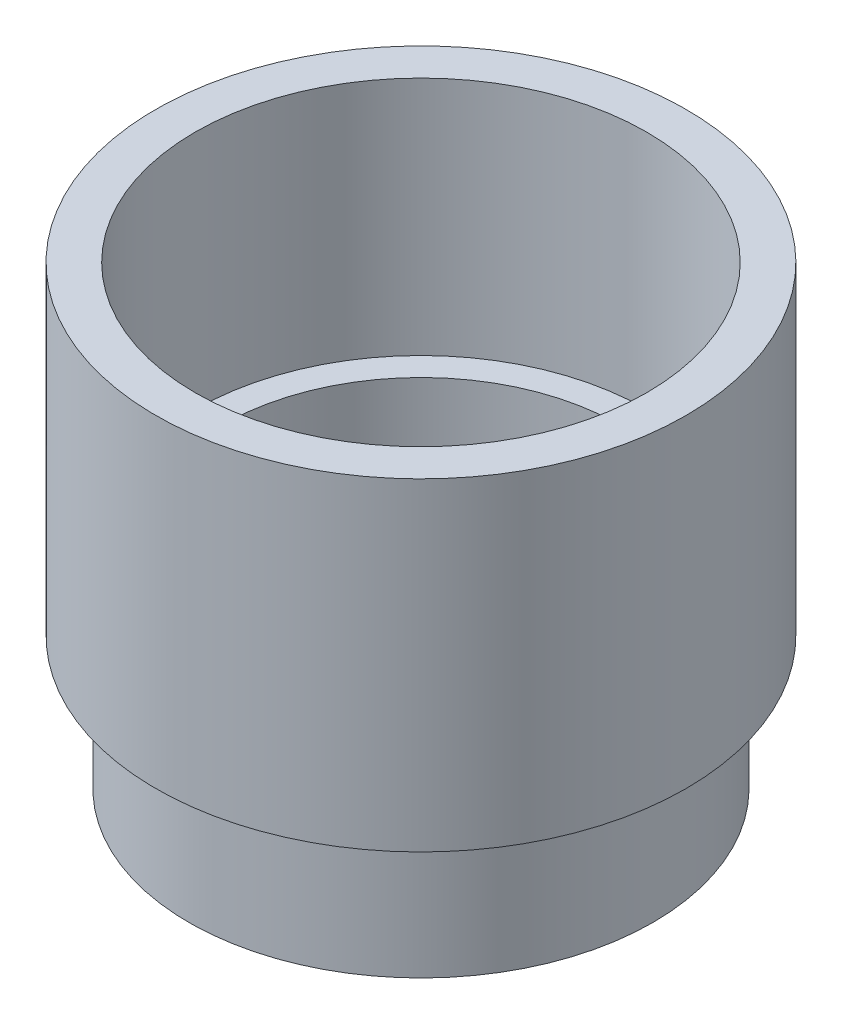
ISO-10303-21;
HEADER;
FILE_DESCRIPTION(('STEP AP214'),'2;1');
FILE_NAME('part.step','',(''),(''),'','','');
FILE_SCHEMA(('AUTOMOTIVE_DESIGN { 1 0 10303 214 1 1 1 1 }'));
ENDSEC;
DATA;
#1=APPLICATION_CONTEXT('core data for automotive mechanical design processes');
#2=APPLICATION_PROTOCOL_DEFINITION('international standard','automotive_design',2000,#1);
#3=PRODUCT_CONTEXT('',#1,'mechanical');
#4=PRODUCT('Part','Part','',(#3));
#5=PRODUCT_RELATED_PRODUCT_CATEGORY('part','',(#4));
#6=PRODUCT_DEFINITION_FORMATION('','',#4);
#7=PRODUCT_DEFINITION_CONTEXT('part definition',#1,'design');
#8=PRODUCT_DEFINITION('design','',#6,#7);
#9=PRODUCT_DEFINITION_SHAPE('','',#8);
#10=(LENGTH_UNIT() NAMED_UNIT(*) SI_UNIT(.MILLI.,.METRE.));
#11=(NAMED_UNIT(*) PLANE_ANGLE_UNIT() SI_UNIT($,.RADIAN.));
#12=(NAMED_UNIT(*) SI_UNIT($,.STERADIAN.) SOLID_ANGLE_UNIT());
#13=UNCERTAINTY_MEASURE_WITH_UNIT(LENGTH_MEASURE(1.E-05),#10,'distance_accuracy_value','');
#14=(GEOMETRIC_REPRESENTATION_CONTEXT(3) GLOBAL_UNCERTAINTY_ASSIGNED_CONTEXT((#13)) GLOBAL_UNIT_ASSIGNED_CONTEXT((#10,
#11,#12)) REPRESENTATION_CONTEXT('',''));
#15=CARTESIAN_POINT('',(0.,0.,0.));
#16=DIRECTION('',(0.,0.,1.));
#17=DIRECTION('',(1.,0.,0.));
#18=AXIS2_PLACEMENT_3D('',#15,#16,#17);
#19=CARTESIAN_POINT('',(3.49148336110938E-12,-1000.,0.));
#20=DIRECTION('',(0.,-1.,0.));
#21=DIRECTION('',(1.,0.,0.));
#22=AXIS2_PLACEMENT_3D('',#19,#20,#21);
#23=CYLINDRICAL_SURFACE('',#22,24.);
#24=CARTESIAN_POINT('',(0.,-1.11022302462516E-13,0.));
#25=DIRECTION('',(0.,-1.,0.));
#26=DIRECTION('',(1.,0.,0.));
#27=AXIS2_PLACEMENT_3D('',#24,#25,#26);
#28=CIRCLE('',#27,24.);
#29=CARTESIAN_POINT('',(24.,0.,0.));
#30=VERTEX_POINT('',#29);
#31=EDGE_CURVE('E10',#30,#30,#28,.T.);
#32=ORIENTED_EDGE('',*,*,#31,.T.);
#33=EDGE_LOOP('',(#32));
#34=FACE_BOUND('',#33,.T.);
#35=CARTESIAN_POINT('',(0.,26.,0.));
#36=DIRECTION('',(0.,-1.,0.));
#37=DIRECTION('',(1.,0.,0.));
#38=AXIS2_PLACEMENT_3D('',#35,#36,#37);
#39=CIRCLE('',#38,24.0000000000001);
#40=CARTESIAN_POINT('',(24.,26.0000000000001,0.));
#41=VERTEX_POINT('',#40);
#42=EDGE_CURVE('E61',#41,#41,#39,.T.);
#43=ORIENTED_EDGE('',*,*,#42,.F.);
#44=EDGE_LOOP('',(#43));
#45=FACE_BOUND('',#44,.T.);
#46=ADVANCED_FACE('F33',(#34,#45),#23,.F.);
#47=CARTESIAN_POINT('',(24.,0.,0.));
#48=DIRECTION('',(0.,-1.,0.));
#49=DIRECTION('',(1.,0.,0.));
#50=AXIS2_PLACEMENT_3D('',#47,#48,#49);
#51=PLANE('',#50);
#52=CARTESIAN_POINT('',(0.,-1.11022302462516E-13,0.));
#53=DIRECTION('',(0.,-1.,0.));
#54=DIRECTION('',(1.,0.,0.));
#55=AXIS2_PLACEMENT_3D('',#52,#53,#54);
#56=CIRCLE('',#55,28.);
#57=CARTESIAN_POINT('',(28.,0.,0.));
#58=VERTEX_POINT('',#57);
#59=EDGE_CURVE('E39',#58,#58,#56,.T.);
#60=ORIENTED_EDGE('',*,*,#59,.T.);
#61=EDGE_LOOP('',(#60));
#62=FACE_BOUND('',#61,.T.);
#63=ORIENTED_EDGE('',*,*,#31,.F.);
#64=EDGE_LOOP('',(#63));
#65=FACE_BOUND('',#64,.T.);
#66=ADVANCED_FACE('F69',(#62,#65),#51,.T.);
#67=CARTESIAN_POINT('',(3.49148336110938E-12,-1000.,0.));
#68=DIRECTION('',(0.,-1.,0.));
#69=DIRECTION('',(1.,0.,0.));
#70=AXIS2_PLACEMENT_3D('',#67,#68,#69);
#71=CYLINDRICAL_SURFACE('',#70,28.);
#72=CARTESIAN_POINT('',(0.,16.,0.));
#73=DIRECTION('',(0.,-1.,0.));
#74=DIRECTION('',(1.,0.,0.));
#75=AXIS2_PLACEMENT_3D('',#72,#73,#74);
#76=CIRCLE('',#75,28.0000000000001);
#77=CARTESIAN_POINT('',(28.,16.0000000000001,0.));
#78=VERTEX_POINT('',#77);
#79=EDGE_CURVE('E43',#78,#78,#76,.T.);
#80=ORIENTED_EDGE('',*,*,#79,.T.);
#81=EDGE_LOOP('',(#80));
#82=FACE_BOUND('',#81,.T.);
#83=ORIENTED_EDGE('',*,*,#59,.F.);
#84=EDGE_LOOP('',(#83));
#85=FACE_BOUND('',#84,.T.);
#86=ADVANCED_FACE('F73',(#82,#85),#71,.T.);
#87=CARTESIAN_POINT('',(28.,16.,0.));
#88=DIRECTION('',(0.,-1.,0.));
#89=DIRECTION('',(1.,0.,0.));
#90=AXIS2_PLACEMENT_3D('',#87,#88,#89);
#91=PLANE('',#90);
#92=CARTESIAN_POINT('',(0.,15.9999999999998,0.));
#93=DIRECTION('',(0.,-1.,0.));
#94=DIRECTION('',(1.,0.,0.));
#95=AXIS2_PLACEMENT_3D('',#92,#93,#94);
#96=CIRCLE('',#95,32.0000000000001);
#97=CARTESIAN_POINT('',(32.,15.9999999999999,0.));
#98=VERTEX_POINT('',#97);
#99=EDGE_CURVE('E47',#98,#98,#96,.T.);
#100=ORIENTED_EDGE('',*,*,#99,.T.);
#101=EDGE_LOOP('',(#100));
#102=FACE_BOUND('',#101,.T.);
#103=ORIENTED_EDGE('',*,*,#79,.F.);
#104=EDGE_LOOP('',(#103));
#105=FACE_BOUND('',#104,.T.);
#106=ADVANCED_FACE('F77',(#102,#105),#91,.T.);
#107=CARTESIAN_POINT('',(3.49148336110938E-12,-1000.,0.));
#108=DIRECTION('',(0.,-1.,0.));
#109=DIRECTION('',(1.,0.,0.));
#110=AXIS2_PLACEMENT_3D('',#107,#108,#109);
#111=CYLINDRICAL_SURFACE('',#110,32.0000000000001);
#112=CARTESIAN_POINT('',(-1.92031584861015E-13,54.9999999999997,0.));
#113=DIRECTION('',(0.,-1.,0.));
#114=DIRECTION('',(1.,0.,0.));
#115=AXIS2_PLACEMENT_3D('',#112,#113,#114);
#116=CIRCLE('',#115,32.0000000000002);
#117=CARTESIAN_POINT('',(32.,54.9999999999998,0.));
#118=VERTEX_POINT('',#117);
#119=EDGE_CURVE('E52',#118,#118,#116,.T.);
#120=ORIENTED_EDGE('',*,*,#119,.T.);
#121=EDGE_LOOP('',(#120));
#122=FACE_BOUND('',#121,.T.);
#123=ORIENTED_EDGE('',*,*,#99,.F.);
#124=EDGE_LOOP('',(#123));
#125=FACE_BOUND('',#124,.T.);
#126=ADVANCED_FACE('F84',(#122,#125),#111,.T.);
#127=CARTESIAN_POINT('',(32.,55.,0.));
#128=DIRECTION('',(0.,1.,0.));
#129=DIRECTION('',(-1.,0.,0.));
#130=AXIS2_PLACEMENT_3D('',#127,#128,#129);
#131=PLANE('',#130);
#132=CARTESIAN_POINT('',(-1.92031584861016E-13,54.9999999999999,0.));
#133=DIRECTION('',(0.,-1.,0.));
#134=DIRECTION('',(1.,0.,0.));
#135=AXIS2_PLACEMENT_3D('',#132,#133,#134);
#136=CIRCLE('',#135,27.2500000000002);
#137=CARTESIAN_POINT('',(27.25,55.,0.));
#138=VERTEX_POINT('',#137);
#139=EDGE_CURVE('E55',#138,#138,#136,.T.);
#140=ORIENTED_EDGE('',*,*,#139,.T.);
#141=EDGE_LOOP('',(#140));
#142=FACE_BOUND('',#141,.T.);
#143=ORIENTED_EDGE('',*,*,#119,.F.);
#144=EDGE_LOOP('',(#143));
#145=FACE_BOUND('',#144,.T.);
#146=ADVANCED_FACE('F88',(#142,#145),#131,.T.);
#147=CARTESIAN_POINT('',(3.49148336110938E-12,-1000.,0.));
#148=DIRECTION('',(0.,-1.,0.));
#149=DIRECTION('',(1.,0.,0.));
#150=AXIS2_PLACEMENT_3D('',#147,#148,#149);
#151=CYLINDRICAL_SURFACE('',#150,27.2500000000001);
#152=CARTESIAN_POINT('',(0.,26.,0.));
#153=DIRECTION('',(0.,-1.,0.));
#154=DIRECTION('',(1.,0.,0.));
#155=AXIS2_PLACEMENT_3D('',#152,#153,#154);
#156=CIRCLE('',#155,27.2500000000001);
#157=CARTESIAN_POINT('',(27.25,26.0000000000001,0.));
#158=VERTEX_POINT('',#157);
#159=EDGE_CURVE('E58',#158,#158,#156,.T.);
#160=ORIENTED_EDGE('',*,*,#159,.T.);
#161=EDGE_LOOP('',(#160));
#162=FACE_BOUND('',#161,.T.);
#163=ORIENTED_EDGE('',*,*,#139,.F.);
#164=EDGE_LOOP('',(#163));
#165=FACE_BOUND('',#164,.T.);
#166=ADVANCED_FACE('F92',(#162,#165),#151,.F.);
#167=CARTESIAN_POINT('',(27.25,26.,0.));
#168=DIRECTION('',(0.,1.,0.));
#169=DIRECTION('',(-1.,0.,0.));
#170=AXIS2_PLACEMENT_3D('',#167,#168,#169);
#171=PLANE('',#170);
#172=ORIENTED_EDGE('',*,*,#42,.T.);
#173=EDGE_LOOP('',(#172));
#174=FACE_BOUND('',#173,.T.);
#175=ORIENTED_EDGE('',*,*,#159,.F.);
#176=EDGE_LOOP('',(#175));
#177=FACE_BOUND('',#176,.T.);
#178=ADVANCED_FACE('F65',(#174,#177),#171,.T.);
#179=CLOSED_SHELL('',(#46,#66,#86,#106,#126,#146,#166,#178));
#180=MANIFOLD_SOLID_BREP('B2',#179);
#181=ADVANCED_BREP_SHAPE_REPRESENTATION('',(#18,#180),#14);
#182=SHAPE_DEFINITION_REPRESENTATION(#9,#181);
ENDSEC;
END-ISO-10303-21;
